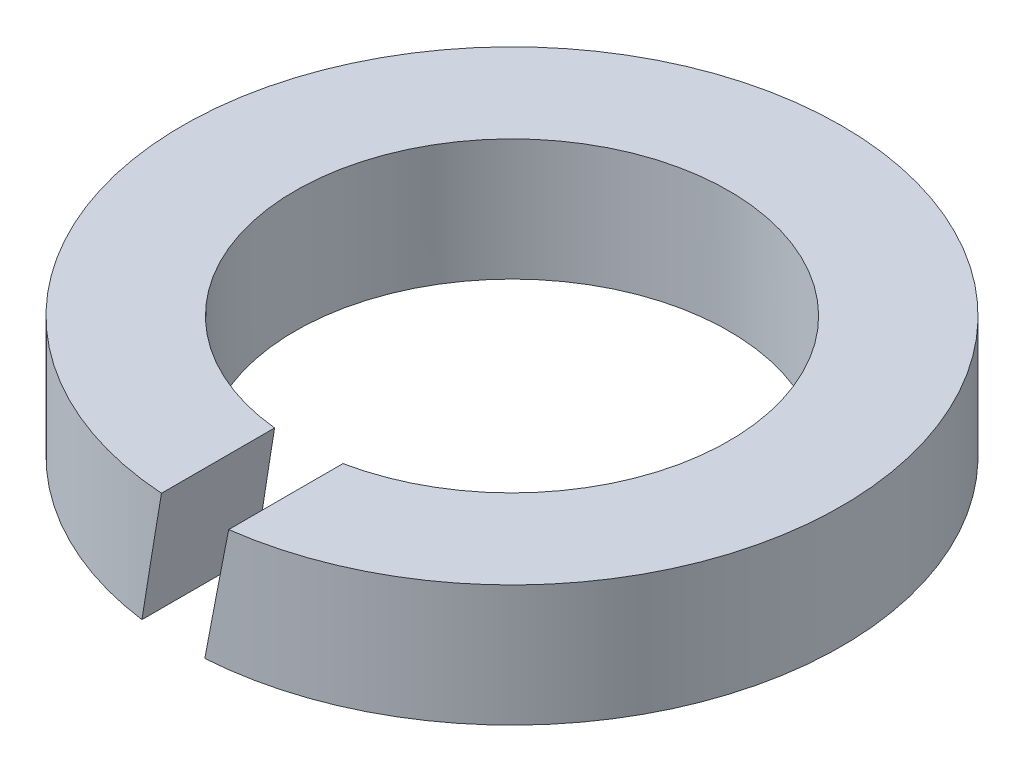
ISO-10303-21;
HEADER;
FILE_DESCRIPTION(('STEP AP214'),'2;1');
FILE_NAME('part.step','',(''),(''),'','','');
FILE_SCHEMA(('AUTOMOTIVE_DESIGN { 1 0 10303 214 1 1 1 1 }'));
ENDSEC;
DATA;
#1=APPLICATION_CONTEXT('core data for automotive mechanical design processes');
#2=APPLICATION_PROTOCOL_DEFINITION('international standard','automotive_design',2000,#1);
#3=PRODUCT_CONTEXT('',#1,'mechanical');
#4=PRODUCT('Part','Part','',(#3));
#5=PRODUCT_RELATED_PRODUCT_CATEGORY('part','',(#4));
#6=PRODUCT_DEFINITION_FORMATION('','',#4);
#7=PRODUCT_DEFINITION_CONTEXT('part definition',#1,'design');
#8=PRODUCT_DEFINITION('design','',#6,#7);
#9=PRODUCT_DEFINITION_SHAPE('','',#8);
#10=(LENGTH_UNIT() NAMED_UNIT(*) SI_UNIT(.MILLI.,.METRE.));
#11=(NAMED_UNIT(*) PLANE_ANGLE_UNIT() SI_UNIT($,.RADIAN.));
#12=(NAMED_UNIT(*) SI_UNIT($,.STERADIAN.) SOLID_ANGLE_UNIT());
#13=UNCERTAINTY_MEASURE_WITH_UNIT(LENGTH_MEASURE(1.E-05),#10,'distance_accuracy_value','');
#14=(GEOMETRIC_REPRESENTATION_CONTEXT(3) GLOBAL_UNCERTAINTY_ASSIGNED_CONTEXT((#13)) GLOBAL_UNIT_ASSIGNED_CONTEXT((#10,
#11,#12)) REPRESENTATION_CONTEXT('',''));
#15=CARTESIAN_POINT('',(0.,0.,0.));
#16=DIRECTION('',(0.,0.,1.));
#17=DIRECTION('',(1.,0.,0.));
#18=AXIS2_PLACEMENT_3D('',#15,#16,#17);
#19=CARTESIAN_POINT('',(0.,1.4,0.));
#20=DIRECTION('',(0.,1.,0.));
#21=DIRECTION('',(0.,0.,1.));
#22=AXIS2_PLACEMENT_3D('',#19,#20,#21);
#23=PLANE('',#22);
#24=CARTESIAN_POINT('',(0.,1.4,0.));
#25=DIRECTION('',(0.,1.,0.));
#26=DIRECTION('',(0.,0.,1.));
#27=AXIS2_PLACEMENT_3D('',#24,#25,#26);
#28=CIRCLE('',#27,2.5);
#29=CARTESIAN_POINT('',(0.499999999999999,1.4,2.44948974278318));
#30=VERTEX_POINT('',#29);
#31=CARTESIAN_POINT('',(-0.25,1.4,2.48746859276655));
#32=VERTEX_POINT('',#31);
#33=EDGE_CURVE('E95',#30,#32,#28,.T.);
#34=ORIENTED_EDGE('',*,*,#33,.F.);
#35=DIRECTION('',(0.,0.,-1.));
#36=VECTOR('',#35,1.);
#37=CARTESIAN_POINT('',(0.5,1.4,3.8));
#38=LINE('',#37,#36);
#39=CARTESIAN_POINT('',(0.499999999999999,1.4,3.76696164036747));
#40=VERTEX_POINT('',#39);
#41=EDGE_CURVE('E58',#40,#30,#38,.T.);
#42=ORIENTED_EDGE('',*,*,#41,.F.);
#43=CARTESIAN_POINT('',(0.,1.4,0.));
#44=DIRECTION('',(0.,1.,0.));
#45=DIRECTION('',(0.,0.,1.));
#46=AXIS2_PLACEMENT_3D('',#43,#44,#45);
#47=CIRCLE('',#46,3.8);
#48=CARTESIAN_POINT('',(-0.25,1.4,3.79176739792936));
#49=VERTEX_POINT('',#48);
#50=EDGE_CURVE('E94',#40,#49,#47,.T.);
#51=ORIENTED_EDGE('',*,*,#50,.T.);
#52=DIRECTION('',(0.,0.,-1.));
#53=VECTOR('',#52,1.);
#54=CARTESIAN_POINT('',(-0.25,1.4,3.8));
#55=LINE('',#54,#53);
#56=EDGE_CURVE('E76',#49,#32,#55,.T.);
#57=ORIENTED_EDGE('',*,*,#56,.T.);
#58=EDGE_LOOP('',(#34,#42,#51,#57));
#59=FACE_BOUND('',#58,.T.);
#60=ADVANCED_FACE('F35',(#59),#23,.T.);
#61=CARTESIAN_POINT('',(0.,0.,0.));
#62=DIRECTION('',(0.,1.,0.));
#63=DIRECTION('',(0.,0.,1.));
#64=AXIS2_PLACEMENT_3D('',#61,#62,#63);
#65=PLANE('',#64);
#66=DIRECTION('',(0.,0.,-1.));
#67=VECTOR('',#66,1.);
#68=CARTESIAN_POINT('',(0.25,0.,3.8));
#69=LINE('',#68,#67);
#70=CARTESIAN_POINT('',(0.25,0.,3.79176739792936));
#71=VERTEX_POINT('',#70);
#72=CARTESIAN_POINT('',(0.25,0.,2.48746859276655));
#73=VERTEX_POINT('',#72);
#74=EDGE_CURVE('E82',#71,#73,#69,.T.);
#75=ORIENTED_EDGE('',*,*,#74,.T.);
#76=CARTESIAN_POINT('',(0.,0.,0.));
#77=DIRECTION('',(0.,1.,0.));
#78=DIRECTION('',(0.,0.,1.));
#79=AXIS2_PLACEMENT_3D('',#76,#77,#78);
#80=CIRCLE('',#79,2.5);
#81=CARTESIAN_POINT('',(-0.5,0.,2.44948974278318));
#82=VERTEX_POINT('',#81);
#83=EDGE_CURVE('E91',#73,#82,#80,.T.);
#84=ORIENTED_EDGE('',*,*,#83,.T.);
#85=DIRECTION('',(0.,0.,-1.));
#86=VECTOR('',#85,1.);
#87=CARTESIAN_POINT('',(-0.5,0.,3.8));
#88=LINE('',#87,#86);
#89=CARTESIAN_POINT('',(-0.5,0.,3.76696164036747));
#90=VERTEX_POINT('',#89);
#91=EDGE_CURVE('E50',#90,#82,#88,.T.);
#92=ORIENTED_EDGE('',*,*,#91,.F.);
#93=CARTESIAN_POINT('',(0.,0.,0.));
#94=DIRECTION('',(0.,1.,0.));
#95=DIRECTION('',(0.,0.,1.));
#96=AXIS2_PLACEMENT_3D('',#93,#94,#95);
#97=CIRCLE('',#96,3.8);
#98=EDGE_CURVE('E89',#71,#90,#97,.T.);
#99=ORIENTED_EDGE('',*,*,#98,.F.);
#100=EDGE_LOOP('',(#75,#84,#92,#99));
#101=FACE_BOUND('',#100,.T.);
#102=ADVANCED_FACE('F88',(#101),#65,.F.);
#103=CARTESIAN_POINT('',(0.,1.4,0.));
#104=DIRECTION('',(0.,-1.,0.));
#105=DIRECTION('',(0.,0.,-1.));
#106=AXIS2_PLACEMENT_3D('',#103,#104,#105);
#107=CYLINDRICAL_SURFACE('',#106,3.8);
#108=CARTESIAN_POINT('',(0.,-1.4,0.));
#109=DIRECTION('',(-0.984427575508482,0.175790638483657,0.));
#110=DIRECTION('',(-0.175790638483657,-0.984427575508482,0.));
#111=AXIS2_PLACEMENT_3D('',#108,#109,#110);
#112=ELLIPSE('',#111,21.6166232330584,3.8);
#113=EDGE_CURVE('E81',#71,#40,#112,.T.);
#114=ORIENTED_EDGE('',*,*,#113,.F.);
#115=ORIENTED_EDGE('',*,*,#98,.T.);
#116=CARTESIAN_POINT('',(0.,2.8,0.));
#117=DIRECTION('',(0.984427575508482,-0.175790638483657,0.));
#118=DIRECTION('',(-0.175790638483657,-0.984427575508482,0.));
#119=AXIS2_PLACEMENT_3D('',#116,#117,#118);
#120=ELLIPSE('',#119,21.6166232330584,3.8);
#121=EDGE_CURVE('E73',#49,#90,#120,.T.);
#122=ORIENTED_EDGE('',*,*,#121,.F.);
#123=ORIENTED_EDGE('',*,*,#50,.F.);
#124=EDGE_LOOP('',(#114,#115,#122,#123));
#125=FACE_BOUND('',#124,.T.);
#126=ADVANCED_FACE('F37',(#125),#107,.T.);
#127=CARTESIAN_POINT('',(0.,1.4,0.));
#128=DIRECTION('',(0.,-1.,0.));
#129=DIRECTION('',(0.,0.,-1.));
#130=AXIS2_PLACEMENT_3D('',#127,#128,#129);
#131=CYLINDRICAL_SURFACE('',#130,2.5);
#132=ORIENTED_EDGE('',*,*,#83,.F.);
#133=CARTESIAN_POINT('',(0.,-1.4,0.));
#134=DIRECTION('',(-0.984427575508482,0.175790638483657,0.));
#135=DIRECTION('',(-0.175790638483657,-0.984427575508482,0.));
#136=AXIS2_PLACEMENT_3D('',#133,#134,#135);
#137=ELLIPSE('',#136,14.2214626533279,2.5);
#138=EDGE_CURVE('E11',#73,#30,#137,.T.);
#139=ORIENTED_EDGE('',*,*,#138,.T.);
#140=ORIENTED_EDGE('',*,*,#33,.T.);
#141=CARTESIAN_POINT('',(0.,2.8,0.));
#142=DIRECTION('',(0.984427575508482,-0.175790638483657,0.));
#143=DIRECTION('',(-0.175790638483657,-0.984427575508482,0.));
#144=AXIS2_PLACEMENT_3D('',#141,#142,#143);
#145=ELLIPSE('',#144,14.2214626533279,2.5);
#146=EDGE_CURVE('E43',#32,#82,#145,.T.);
#147=ORIENTED_EDGE('',*,*,#146,.T.);
#148=EDGE_LOOP('',(#132,#139,#140,#147));
#149=FACE_BOUND('',#148,.T.);
#150=ADVANCED_FACE('F102',(#149),#131,.F.);
#151=CARTESIAN_POINT('',(-0.5,0.,3.8));
#152=DIRECTION('',(0.984427575508482,-0.175790638483657,0.));
#153=DIRECTION('',(0.175790638483657,0.984427575508482,0.));
#154=AXIS2_PLACEMENT_3D('',#151,#152,#153);
#155=PLANE('',#154);
#156=ORIENTED_EDGE('',*,*,#121,.T.);
#157=ORIENTED_EDGE('',*,*,#91,.T.);
#158=ORIENTED_EDGE('',*,*,#146,.F.);
#159=ORIENTED_EDGE('',*,*,#56,.F.);
#160=EDGE_LOOP('',(#156,#157,#158,#159));
#161=FACE_BOUND('',#160,.T.);
#162=ADVANCED_FACE('F74',(#161),#155,.T.);
#163=CARTESIAN_POINT('',(0.25,0.,3.8));
#164=DIRECTION('',(-0.984427575508482,0.175790638483657,0.));
#165=DIRECTION('',(-0.175790638483657,-0.984427575508482,0.));
#166=AXIS2_PLACEMENT_3D('',#163,#164,#165);
#167=PLANE('',#166);
#168=ORIENTED_EDGE('',*,*,#113,.T.);
#169=ORIENTED_EDGE('',*,*,#41,.T.);
#170=ORIENTED_EDGE('',*,*,#138,.F.);
#171=ORIENTED_EDGE('',*,*,#74,.F.);
#172=EDGE_LOOP('',(#168,#169,#170,#171));
#173=FACE_BOUND('',#172,.T.);
#174=ADVANCED_FACE('F109',(#173),#167,.T.);
#175=CLOSED_SHELL('',(#60,#102,#126,#150,#162,#174));
#176=MANIFOLD_SOLID_BREP('B2',#175);
#177=ADVANCED_BREP_SHAPE_REPRESENTATION('',(#18,#176),#14);
#178=SHAPE_DEFINITION_REPRESENTATION(#9,#177);
ENDSEC;
END-ISO-10303-21;
